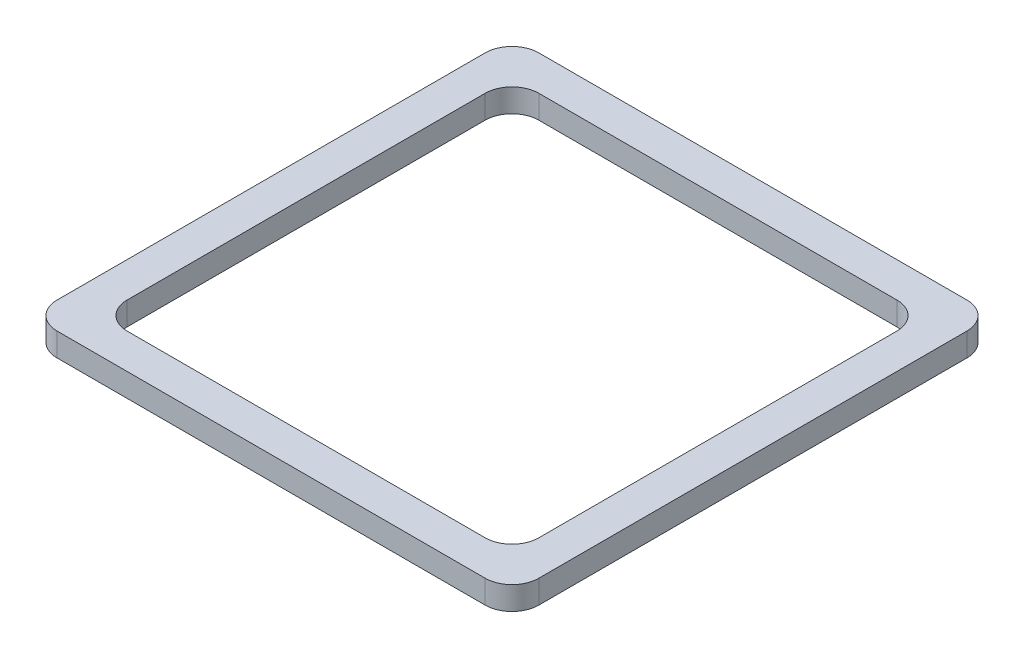
ISO-10303-21;
HEADER;
FILE_DESCRIPTION(('STEP AP214'),'2;1');
FILE_NAME('part.step','',(''),(''),'','','');
FILE_SCHEMA(('AUTOMOTIVE_DESIGN { 1 0 10303 214 1 1 1 1 }'));
ENDSEC;
DATA;
#1=APPLICATION_CONTEXT('core data for automotive mechanical design processes');
#2=APPLICATION_PROTOCOL_DEFINITION('international standard','automotive_design',2000,#1);
#3=PRODUCT_CONTEXT('',#1,'mechanical');
#4=PRODUCT('Part','Part','',(#3));
#5=PRODUCT_RELATED_PRODUCT_CATEGORY('part','',(#4));
#6=PRODUCT_DEFINITION_FORMATION('','',#4);
#7=PRODUCT_DEFINITION_CONTEXT('part definition',#1,'design');
#8=PRODUCT_DEFINITION('design','',#6,#7);
#9=PRODUCT_DEFINITION_SHAPE('','',#8);
#10=(LENGTH_UNIT() NAMED_UNIT(*) SI_UNIT(.MILLI.,.METRE.));
#11=(NAMED_UNIT(*) PLANE_ANGLE_UNIT() SI_UNIT($,.RADIAN.));
#12=(NAMED_UNIT(*) SI_UNIT($,.STERADIAN.) SOLID_ANGLE_UNIT());
#13=UNCERTAINTY_MEASURE_WITH_UNIT(LENGTH_MEASURE(1.E-05),#10,'distance_accuracy_value','');
#14=(GEOMETRIC_REPRESENTATION_CONTEXT(3) GLOBAL_UNCERTAINTY_ASSIGNED_CONTEXT((#13)) GLOBAL_UNIT_ASSIGNED_CONTEXT((#10,
#11,#12)) REPRESENTATION_CONTEXT('',''));
#15=CARTESIAN_POINT('',(0.,0.,0.));
#16=DIRECTION('',(0.,0.,1.));
#17=DIRECTION('',(1.,0.,0.));
#18=AXIS2_PLACEMENT_3D('',#15,#16,#17);
#19=CARTESIAN_POINT('',(0.,1.,10.325));
#20=DIRECTION('',(0.,0.,-1.));
#21=DIRECTION('',(-1.,0.,0.));
#22=AXIS2_PLACEMENT_3D('',#19,#20,#21);
#23=PLANE('',#22);
#24=DIRECTION('',(1.,0.,0.));
#25=VECTOR('',#24,1.);
#26=CARTESIAN_POINT('',(0.,1.,10.325));
#27=LINE('',#26,#25);
#28=CARTESIAN_POINT('',(-9.175,1.,10.325));
#29=VERTEX_POINT('',#28);
#30=CARTESIAN_POINT('',(9.175,1.,10.325));
#31=VERTEX_POINT('',#30);
#32=EDGE_CURVE('E192',#29,#31,#27,.T.);
#33=ORIENTED_EDGE('',*,*,#32,.F.);
#34=DIRECTION('',(0.,-1.,0.));
#35=VECTOR('',#34,1.);
#36=CARTESIAN_POINT('',(-9.175,0.,10.325));
#37=LINE('',#36,#35);
#38=CARTESIAN_POINT('',(-9.175,0.,10.325));
#39=VERTEX_POINT('',#38);
#40=EDGE_CURVE('E269',#29,#39,#37,.T.);
#41=ORIENTED_EDGE('',*,*,#40,.T.);
#42=DIRECTION('',(1.,0.,0.));
#43=VECTOR('',#42,1.);
#44=CARTESIAN_POINT('',(0.,0.,10.325));
#45=LINE('',#44,#43);
#46=CARTESIAN_POINT('',(9.175,0.,10.325));
#47=VERTEX_POINT('',#46);
#48=EDGE_CURVE('E220',#39,#47,#45,.T.);
#49=ORIENTED_EDGE('',*,*,#48,.T.);
#50=DIRECTION('',(0.,-1.,0.));
#51=VECTOR('',#50,1.);
#52=CARTESIAN_POINT('',(9.175,1.,10.325));
#53=LINE('',#52,#51);
#54=EDGE_CURVE('E267',#47,#31,#53,.F.);
#55=ORIENTED_EDGE('',*,*,#54,.T.);
#56=EDGE_LOOP('',(#33,#41,#49,#55));
#57=FACE_BOUND('',#56,.T.);
#58=ADVANCED_FACE('F37',(#57),#23,.F.);
#59=CARTESIAN_POINT('',(10.325,1.,0.));
#60=DIRECTION('',(-1.,0.,0.));
#61=DIRECTION('',(0.,0.,1.));
#62=AXIS2_PLACEMENT_3D('',#59,#60,#61);
#63=PLANE('',#62);
#64=DIRECTION('',(0.,0.,-1.));
#65=VECTOR('',#64,1.);
#66=CARTESIAN_POINT('',(10.325,1.,0.));
#67=LINE('',#66,#65);
#68=CARTESIAN_POINT('',(10.325,1.,9.175));
#69=VERTEX_POINT('',#68);
#70=CARTESIAN_POINT('',(10.325,1.,-9.175));
#71=VERTEX_POINT('',#70);
#72=EDGE_CURVE('E194',#69,#71,#67,.T.);
#73=ORIENTED_EDGE('',*,*,#72,.F.);
#74=DIRECTION('',(0.,-1.,0.));
#75=VECTOR('',#74,1.);
#76=CARTESIAN_POINT('',(10.325,1.,9.175));
#77=LINE('',#76,#75);
#78=CARTESIAN_POINT('',(10.325,0.,9.175));
#79=VERTEX_POINT('',#78);
#80=EDGE_CURVE('E11',#69,#79,#77,.T.);
#81=ORIENTED_EDGE('',*,*,#80,.T.);
#82=DIRECTION('',(0.,0.,-1.));
#83=VECTOR('',#82,1.);
#84=CARTESIAN_POINT('',(10.325,0.,0.));
#85=LINE('',#84,#83);
#86=CARTESIAN_POINT('',(10.325,0.,-9.175));
#87=VERTEX_POINT('',#86);
#88=EDGE_CURVE('E223',#79,#87,#85,.T.);
#89=ORIENTED_EDGE('',*,*,#88,.T.);
#90=DIRECTION('',(0.,-1.,0.));
#91=VECTOR('',#90,1.);
#92=CARTESIAN_POINT('',(10.325,1.,-9.175));
#93=LINE('',#92,#91);
#94=EDGE_CURVE('E45',#87,#71,#93,.F.);
#95=ORIENTED_EDGE('',*,*,#94,.T.);
#96=EDGE_LOOP('',(#73,#81,#89,#95));
#97=FACE_BOUND('',#96,.T.);
#98=ADVANCED_FACE('F285',(#97),#63,.F.);
#99=CARTESIAN_POINT('',(0.,1.,-10.325));
#100=DIRECTION('',(0.,0.,-1.));
#101=DIRECTION('',(-1.,0.,0.));
#102=AXIS2_PLACEMENT_3D('',#99,#100,#101);
#103=PLANE('',#102);
#104=DIRECTION('',(1.,0.,0.));
#105=VECTOR('',#104,1.);
#106=CARTESIAN_POINT('',(0.,0.,-10.325));
#107=LINE('',#106,#105);
#108=CARTESIAN_POINT('',(-9.175,0.,-10.325));
#109=VERTEX_POINT('',#108);
#110=CARTESIAN_POINT('',(9.175,0.,-10.325));
#111=VERTEX_POINT('',#110);
#112=EDGE_CURVE('E179',#109,#111,#107,.T.);
#113=ORIENTED_EDGE('',*,*,#112,.F.);
#114=DIRECTION('',(0.,-1.,0.));
#115=VECTOR('',#114,1.);
#116=CARTESIAN_POINT('',(-9.175,1.,-10.325));
#117=LINE('',#116,#115);
#118=CARTESIAN_POINT('',(-9.175,1.,-10.325));
#119=VERTEX_POINT('',#118);
#120=EDGE_CURVE('E258',#109,#119,#117,.F.);
#121=ORIENTED_EDGE('',*,*,#120,.T.);
#122=DIRECTION('',(1.,0.,0.));
#123=VECTOR('',#122,1.);
#124=CARTESIAN_POINT('',(0.,1.,-10.325));
#125=LINE('',#124,#123);
#126=CARTESIAN_POINT('',(9.175,1.,-10.325));
#127=VERTEX_POINT('',#126);
#128=EDGE_CURVE('E196',#119,#127,#125,.T.);
#129=ORIENTED_EDGE('',*,*,#128,.T.);
#130=DIRECTION('',(0.,-1.,0.));
#131=VECTOR('',#130,1.);
#132=CARTESIAN_POINT('',(9.175,0.,-10.325));
#133=LINE('',#132,#131);
#134=EDGE_CURVE('E255',#127,#111,#133,.T.);
#135=ORIENTED_EDGE('',*,*,#134,.T.);
#136=EDGE_LOOP('',(#113,#121,#129,#135));
#137=FACE_BOUND('',#136,.T.);
#138=ADVANCED_FACE('F292',(#137),#103,.T.);
#139=CARTESIAN_POINT('',(8.825,1.,0.));
#140=DIRECTION('',(-1.,0.,0.));
#141=DIRECTION('',(0.,0.,1.));
#142=AXIS2_PLACEMENT_3D('',#139,#140,#141);
#143=PLANE('',#142);
#144=DIRECTION('',(0.,0.,-1.));
#145=VECTOR('',#144,1.);
#146=CARTESIAN_POINT('',(8.825,0.,0.));
#147=LINE('',#146,#145);
#148=CARTESIAN_POINT('',(8.825,0.,7.675));
#149=VERTEX_POINT('',#148);
#150=CARTESIAN_POINT('',(8.825,0.,-7.675));
#151=VERTEX_POINT('',#150);
#152=EDGE_CURVE('E157',#149,#151,#147,.T.);
#153=ORIENTED_EDGE('',*,*,#152,.F.);
#154=DIRECTION('',(0.,-1.,0.));
#155=VECTOR('',#154,1.);
#156=CARTESIAN_POINT('',(8.825,1.,7.675));
#157=LINE('',#156,#155);
#158=CARTESIAN_POINT('',(8.825,1.,7.675));
#159=VERTEX_POINT('',#158);
#160=EDGE_CURVE('E151',#159,#149,#157,.T.);
#161=ORIENTED_EDGE('',*,*,#160,.F.);
#162=DIRECTION('',(0.,0.,-1.));
#163=VECTOR('',#162,1.);
#164=CARTESIAN_POINT('',(8.825,1.,0.));
#165=LINE('',#164,#163);
#166=CARTESIAN_POINT('',(8.825,1.,-7.675));
#167=VERTEX_POINT('',#166);
#168=EDGE_CURVE('E155',#159,#167,#165,.T.);
#169=ORIENTED_EDGE('',*,*,#168,.T.);
#170=DIRECTION('',(0.,-1.,0.));
#171=VECTOR('',#170,1.);
#172=CARTESIAN_POINT('',(8.825,1.,-7.675));
#173=LINE('',#172,#171);
#174=EDGE_CURVE('E202',#167,#151,#173,.T.);
#175=ORIENTED_EDGE('',*,*,#174,.T.);
#176=EDGE_LOOP('',(#153,#161,#169,#175));
#177=FACE_BOUND('',#176,.T.);
#178=ADVANCED_FACE('F153',(#177),#143,.T.);
#179=CARTESIAN_POINT('',(7.675,1.,7.675));
#180=DIRECTION('',(0.,-1.,0.));
#181=DIRECTION('',(0.,0.,-1.));
#182=AXIS2_PLACEMENT_3D('',#179,#180,#181);
#183=CYLINDRICAL_SURFACE('',#182,1.15);
#184=CARTESIAN_POINT('',(7.675,0.,7.675));
#185=DIRECTION('',(0.,1.,0.));
#186=DIRECTION('',(0.,0.,1.));
#187=AXIS2_PLACEMENT_3D('',#184,#185,#186);
#188=CIRCLE('',#187,1.15);
#189=CARTESIAN_POINT('',(7.675,0.,8.825));
#190=VERTEX_POINT('',#189);
#191=EDGE_CURVE('E204',#149,#190,#188,.F.);
#192=ORIENTED_EDGE('',*,*,#191,.T.);
#193=DIRECTION('',(0.,-1.,0.));
#194=VECTOR('',#193,1.);
#195=CARTESIAN_POINT('',(7.675,1.,8.825));
#196=LINE('',#195,#194);
#197=CARTESIAN_POINT('',(7.675,1.,8.825));
#198=VERTEX_POINT('',#197);
#199=EDGE_CURVE('E162',#198,#190,#196,.T.);
#200=ORIENTED_EDGE('',*,*,#199,.F.);
#201=CARTESIAN_POINT('',(7.675,1.,7.675));
#202=DIRECTION('',(0.,1.,0.));
#203=DIRECTION('',(0.,0.,1.));
#204=AXIS2_PLACEMENT_3D('',#201,#202,#203);
#205=CIRCLE('',#204,1.15);
#206=EDGE_CURVE('E165',#159,#198,#205,.F.);
#207=ORIENTED_EDGE('',*,*,#206,.F.);
#208=ORIENTED_EDGE('',*,*,#160,.T.);
#209=EDGE_LOOP('',(#192,#200,#207,#208));
#210=FACE_BOUND('',#209,.T.);
#211=ADVANCED_FACE('F166',(#210),#183,.F.);
#212=CARTESIAN_POINT('',(0.,1.,8.825));
#213=DIRECTION('',(0.,0.,-1.));
#214=DIRECTION('',(-1.,0.,0.));
#215=AXIS2_PLACEMENT_3D('',#212,#213,#214);
#216=PLANE('',#215);
#217=DIRECTION('',(1.,0.,0.));
#218=VECTOR('',#217,1.);
#219=CARTESIAN_POINT('',(0.,0.,8.825));
#220=LINE('',#219,#218);
#221=CARTESIAN_POINT('',(-7.675,0.,8.825));
#222=VERTEX_POINT('',#221);
#223=EDGE_CURVE('E206',#222,#190,#220,.T.);
#224=ORIENTED_EDGE('',*,*,#223,.F.);
#225=DIRECTION('',(0.,-1.,0.));
#226=VECTOR('',#225,1.);
#227=CARTESIAN_POINT('',(-7.675,1.,8.825));
#228=LINE('',#227,#226);
#229=CARTESIAN_POINT('',(-7.675,1.,8.825));
#230=VERTEX_POINT('',#229);
#231=EDGE_CURVE('E240',#230,#222,#228,.T.);
#232=ORIENTED_EDGE('',*,*,#231,.F.);
#233=DIRECTION('',(1.,0.,0.));
#234=VECTOR('',#233,1.);
#235=CARTESIAN_POINT('',(0.,1.,8.825));
#236=LINE('',#235,#234);
#237=EDGE_CURVE('E170',#230,#198,#236,.T.);
#238=ORIENTED_EDGE('',*,*,#237,.T.);
#239=ORIENTED_EDGE('',*,*,#199,.T.);
#240=EDGE_LOOP('',(#224,#232,#238,#239));
#241=FACE_BOUND('',#240,.T.);
#242=ADVANCED_FACE('F337',(#241),#216,.T.);
#243=CARTESIAN_POINT('',(-7.675,1.,7.675));
#244=DIRECTION('',(0.,-1.,0.));
#245=DIRECTION('',(0.,0.,-1.));
#246=AXIS2_PLACEMENT_3D('',#243,#244,#245);
#247=CYLINDRICAL_SURFACE('',#246,1.15);
#248=CARTESIAN_POINT('',(-7.675,0.,7.675));
#249=DIRECTION('',(0.,1.,0.));
#250=DIRECTION('',(0.,0.,1.));
#251=AXIS2_PLACEMENT_3D('',#248,#249,#250);
#252=CIRCLE('',#251,1.15);
#253=CARTESIAN_POINT('',(-8.825,0.,7.675));
#254=VERTEX_POINT('',#253);
#255=EDGE_CURVE('E209',#222,#254,#252,.F.);
#256=ORIENTED_EDGE('',*,*,#255,.T.);
#257=DIRECTION('',(0.,-1.,0.));
#258=VECTOR('',#257,1.);
#259=CARTESIAN_POINT('',(-8.825,1.,7.675));
#260=LINE('',#259,#258);
#261=CARTESIAN_POINT('',(-8.825,1.,7.675));
#262=VERTEX_POINT('',#261);
#263=EDGE_CURVE('E237',#262,#254,#260,.T.);
#264=ORIENTED_EDGE('',*,*,#263,.F.);
#265=CARTESIAN_POINT('',(-7.675,1.,7.675));
#266=DIRECTION('',(0.,1.,0.));
#267=DIRECTION('',(0.,0.,1.));
#268=AXIS2_PLACEMENT_3D('',#265,#266,#267);
#269=CIRCLE('',#268,1.15);
#270=EDGE_CURVE('E183',#230,#262,#269,.F.);
#271=ORIENTED_EDGE('',*,*,#270,.F.);
#272=ORIENTED_EDGE('',*,*,#231,.T.);
#273=EDGE_LOOP('',(#256,#264,#271,#272));
#274=FACE_BOUND('',#273,.T.);
#275=ADVANCED_FACE('F333',(#274),#247,.F.);
#276=CARTESIAN_POINT('',(-8.825,1.,0.));
#277=DIRECTION('',(-1.,0.,0.));
#278=DIRECTION('',(0.,0.,1.));
#279=AXIS2_PLACEMENT_3D('',#276,#277,#278);
#280=PLANE('',#279);
#281=DIRECTION('',(0.,0.,-1.));
#282=VECTOR('',#281,1.);
#283=CARTESIAN_POINT('',(-8.825,0.,0.));
#284=LINE('',#283,#282);
#285=CARTESIAN_POINT('',(-8.825,0.,-7.675));
#286=VERTEX_POINT('',#285);
#287=EDGE_CURVE('E211',#254,#286,#284,.T.);
#288=ORIENTED_EDGE('',*,*,#287,.T.);
#289=DIRECTION('',(0.,-1.,0.));
#290=VECTOR('',#289,1.);
#291=CARTESIAN_POINT('',(-8.825,1.,-7.675));
#292=LINE('',#291,#290);
#293=CARTESIAN_POINT('',(-8.825,1.,-7.675));
#294=VERTEX_POINT('',#293);
#295=EDGE_CURVE('E234',#294,#286,#292,.T.);
#296=ORIENTED_EDGE('',*,*,#295,.F.);
#297=DIRECTION('',(0.,0.,-1.));
#298=VECTOR('',#297,1.);
#299=CARTESIAN_POINT('',(-8.825,1.,0.));
#300=LINE('',#299,#298);
#301=EDGE_CURVE('E185',#262,#294,#300,.T.);
#302=ORIENTED_EDGE('',*,*,#301,.F.);
#303=ORIENTED_EDGE('',*,*,#263,.T.);
#304=EDGE_LOOP('',(#288,#296,#302,#303));
#305=FACE_BOUND('',#304,.T.);
#306=ADVANCED_FACE('F329',(#305),#280,.F.);
#307=CARTESIAN_POINT('',(-7.675,1.,-7.675));
#308=DIRECTION('',(0.,-1.,0.));
#309=DIRECTION('',(0.,0.,-1.));
#310=AXIS2_PLACEMENT_3D('',#307,#308,#309);
#311=CYLINDRICAL_SURFACE('',#310,1.15);
#312=CARTESIAN_POINT('',(-7.675,0.,-7.675));
#313=DIRECTION('',(0.,1.,0.));
#314=DIRECTION('',(0.,0.,1.));
#315=AXIS2_PLACEMENT_3D('',#312,#313,#314);
#316=CIRCLE('',#315,1.15);
#317=CARTESIAN_POINT('',(-7.675,0.,-8.825));
#318=VERTEX_POINT('',#317);
#319=EDGE_CURVE('E213',#286,#318,#316,.F.);
#320=ORIENTED_EDGE('',*,*,#319,.T.);
#321=DIRECTION('',(0.,-1.,0.));
#322=VECTOR('',#321,1.);
#323=CARTESIAN_POINT('',(-7.675,1.,-8.825));
#324=LINE('',#323,#322);
#325=CARTESIAN_POINT('',(-7.675,1.,-8.825));
#326=VERTEX_POINT('',#325);
#327=EDGE_CURVE('E231',#326,#318,#324,.T.);
#328=ORIENTED_EDGE('',*,*,#327,.F.);
#329=CARTESIAN_POINT('',(-7.675,1.,-7.675));
#330=DIRECTION('',(0.,1.,0.));
#331=DIRECTION('',(0.,0.,1.));
#332=AXIS2_PLACEMENT_3D('',#329,#330,#331);
#333=CIRCLE('',#332,1.15);
#334=EDGE_CURVE('E187',#294,#326,#333,.F.);
#335=ORIENTED_EDGE('',*,*,#334,.F.);
#336=ORIENTED_EDGE('',*,*,#295,.T.);
#337=EDGE_LOOP('',(#320,#328,#335,#336));
#338=FACE_BOUND('',#337,.T.);
#339=ADVANCED_FACE('F325',(#338),#311,.F.);
#340=CARTESIAN_POINT('',(0.,1.,-8.825));
#341=DIRECTION('',(0.,0.,-1.));
#342=DIRECTION('',(-1.,0.,0.));
#343=AXIS2_PLACEMENT_3D('',#340,#341,#342);
#344=PLANE('',#343);
#345=DIRECTION('',(1.,0.,0.));
#346=VECTOR('',#345,1.);
#347=CARTESIAN_POINT('',(0.,0.,-8.825));
#348=LINE('',#347,#346);
#349=CARTESIAN_POINT('',(7.675,0.,-8.825));
#350=VERTEX_POINT('',#349);
#351=EDGE_CURVE('E215',#318,#350,#348,.T.);
#352=ORIENTED_EDGE('',*,*,#351,.T.);
#353=DIRECTION('',(0.,-1.,0.));
#354=VECTOR('',#353,1.);
#355=CARTESIAN_POINT('',(7.675,1.,-8.825));
#356=LINE('',#355,#354);
#357=CARTESIAN_POINT('',(7.675,1.,-8.825));
#358=VERTEX_POINT('',#357);
#359=EDGE_CURVE('E228',#358,#350,#356,.T.);
#360=ORIENTED_EDGE('',*,*,#359,.F.);
#361=DIRECTION('',(1.,0.,0.));
#362=VECTOR('',#361,1.);
#363=CARTESIAN_POINT('',(0.,1.,-8.825));
#364=LINE('',#363,#362);
#365=EDGE_CURVE('E189',#326,#358,#364,.T.);
#366=ORIENTED_EDGE('',*,*,#365,.F.);
#367=ORIENTED_EDGE('',*,*,#327,.T.);
#368=EDGE_LOOP('',(#352,#360,#366,#367));
#369=FACE_BOUND('',#368,.T.);
#370=ADVANCED_FACE('F321',(#369),#344,.F.);
#371=CARTESIAN_POINT('',(7.675,1.,-7.675));
#372=DIRECTION('',(0.,-1.,0.));
#373=DIRECTION('',(0.,0.,-1.));
#374=AXIS2_PLACEMENT_3D('',#371,#372,#373);
#375=CYLINDRICAL_SURFACE('',#374,1.15);
#376=CARTESIAN_POINT('',(7.675,0.,-7.675));
#377=DIRECTION('',(0.,1.,0.));
#378=DIRECTION('',(0.,0.,1.));
#379=AXIS2_PLACEMENT_3D('',#376,#377,#378);
#380=CIRCLE('',#379,1.15);
#381=EDGE_CURVE('E217',#350,#151,#380,.F.);
#382=ORIENTED_EDGE('',*,*,#381,.T.);
#383=ORIENTED_EDGE('',*,*,#174,.F.);
#384=CARTESIAN_POINT('',(7.675,1.,-7.675));
#385=DIRECTION('',(0.,1.,0.));
#386=DIRECTION('',(0.,0.,1.));
#387=AXIS2_PLACEMENT_3D('',#384,#385,#386);
#388=CIRCLE('',#387,1.15);
#389=EDGE_CURVE('E174',#358,#167,#388,.F.);
#390=ORIENTED_EDGE('',*,*,#389,.F.);
#391=ORIENTED_EDGE('',*,*,#359,.T.);
#392=EDGE_LOOP('',(#382,#383,#390,#391));
#393=FACE_BOUND('',#392,.T.);
#394=ADVANCED_FACE('F318',(#393),#375,.F.);
#395=CARTESIAN_POINT('',(-10.325,1.,0.));
#396=DIRECTION('',(-1.,0.,0.));
#397=DIRECTION('',(0.,0.,1.));
#398=AXIS2_PLACEMENT_3D('',#395,#396,#397);
#399=PLANE('',#398);
#400=DIRECTION('',(0.,0.,-1.));
#401=VECTOR('',#400,1.);
#402=CARTESIAN_POINT('',(-10.325,1.,0.));
#403=LINE('',#402,#401);
#404=CARTESIAN_POINT('',(-10.325,1.,9.175));
#405=VERTEX_POINT('',#404);
#406=CARTESIAN_POINT('',(-10.325,1.,-9.175));
#407=VERTEX_POINT('',#406);
#408=EDGE_CURVE('E199',#405,#407,#403,.T.);
#409=ORIENTED_EDGE('',*,*,#408,.T.);
#410=DIRECTION('',(0.,-1.,0.));
#411=VECTOR('',#410,1.);
#412=CARTESIAN_POINT('',(-10.325,1.,-9.175));
#413=LINE('',#412,#411);
#414=CARTESIAN_POINT('',(-10.325,0.,-9.175));
#415=VERTEX_POINT('',#414);
#416=EDGE_CURVE('E244',#407,#415,#413,.T.);
#417=ORIENTED_EDGE('',*,*,#416,.T.);
#418=DIRECTION('',(0.,0.,-1.));
#419=VECTOR('',#418,1.);
#420=CARTESIAN_POINT('',(-10.325,0.,0.));
#421=LINE('',#420,#419);
#422=CARTESIAN_POINT('',(-10.325,0.,9.175));
#423=VERTEX_POINT('',#422);
#424=EDGE_CURVE('E176',#423,#415,#421,.T.);
#425=ORIENTED_EDGE('',*,*,#424,.F.);
#426=DIRECTION('',(0.,-1.,0.));
#427=VECTOR('',#426,1.);
#428=CARTESIAN_POINT('',(-10.325,1.,9.175));
#429=LINE('',#428,#427);
#430=EDGE_CURVE('E161',#423,#405,#429,.F.);
#431=ORIENTED_EDGE('',*,*,#430,.T.);
#432=EDGE_LOOP('',(#409,#417,#425,#431));
#433=FACE_BOUND('',#432,.T.);
#434=ADVANCED_FACE('F299',(#433),#399,.T.);
#435=CARTESIAN_POINT('',(0.,1.,0.));
#436=DIRECTION('',(0.,1.,0.));
#437=DIRECTION('',(0.,0.,1.));
#438=AXIS2_PLACEMENT_3D('',#435,#436,#437);
#439=PLANE('',#438);
#440=ORIENTED_EDGE('',*,*,#168,.F.);
#441=ORIENTED_EDGE('',*,*,#206,.T.);
#442=ORIENTED_EDGE('',*,*,#237,.F.);
#443=ORIENTED_EDGE('',*,*,#270,.T.);
#444=ORIENTED_EDGE('',*,*,#301,.T.);
#445=ORIENTED_EDGE('',*,*,#334,.T.);
#446=ORIENTED_EDGE('',*,*,#365,.T.);
#447=ORIENTED_EDGE('',*,*,#389,.T.);
#448=EDGE_LOOP('',(#440,#441,#442,#443,#444,#445,#446,#447));
#449=FACE_BOUND('',#448,.T.);
#450=ORIENTED_EDGE('',*,*,#128,.F.);
#451=CARTESIAN_POINT('',(-9.175,1.,-9.175));
#452=DIRECTION('',(0.,1.,0.));
#453=DIRECTION('',(0.,0.,1.));
#454=AXIS2_PLACEMENT_3D('',#451,#452,#453);
#455=CIRCLE('',#454,1.15);
#456=EDGE_CURVE('E265',#119,#407,#455,.T.);
#457=ORIENTED_EDGE('',*,*,#456,.T.);
#458=ORIENTED_EDGE('',*,*,#408,.F.);
#459=CARTESIAN_POINT('',(-9.175,1.,9.175));
#460=DIRECTION('',(0.,1.,0.));
#461=DIRECTION('',(0.,0.,1.));
#462=AXIS2_PLACEMENT_3D('',#459,#460,#461);
#463=CIRCLE('',#462,1.15);
#464=EDGE_CURVE('E263',#405,#29,#463,.T.);
#465=ORIENTED_EDGE('',*,*,#464,.T.);
#466=ORIENTED_EDGE('',*,*,#32,.T.);
#467=CARTESIAN_POINT('',(9.175,1.,9.175));
#468=DIRECTION('',(0.,1.,0.));
#469=DIRECTION('',(0.,0.,1.));
#470=AXIS2_PLACEMENT_3D('',#467,#468,#469);
#471=CIRCLE('',#470,1.15);
#472=EDGE_CURVE('E58',#31,#69,#471,.T.);
#473=ORIENTED_EDGE('',*,*,#472,.T.);
#474=ORIENTED_EDGE('',*,*,#72,.T.);
#475=CARTESIAN_POINT('',(9.175,1.,-9.175));
#476=DIRECTION('',(0.,1.,0.));
#477=DIRECTION('',(0.,0.,1.));
#478=AXIS2_PLACEMENT_3D('',#475,#476,#477);
#479=CIRCLE('',#478,1.15);
#480=EDGE_CURVE('E260',#71,#127,#479,.T.);
#481=ORIENTED_EDGE('',*,*,#480,.T.);
#482=EDGE_LOOP('',(#450,#457,#458,#465,#466,#473,#474,#481));
#483=FACE_BOUND('',#482,.T.);
#484=ADVANCED_FACE('F172',(#449,#483),#439,.T.);
#485=CARTESIAN_POINT('',(0.,0.,0.));
#486=DIRECTION('',(0.,1.,0.));
#487=DIRECTION('',(0.,0.,1.));
#488=AXIS2_PLACEMENT_3D('',#485,#486,#487);
#489=PLANE('',#488);
#490=ORIENTED_EDGE('',*,*,#152,.T.);
#491=ORIENTED_EDGE('',*,*,#381,.F.);
#492=ORIENTED_EDGE('',*,*,#351,.F.);
#493=ORIENTED_EDGE('',*,*,#319,.F.);
#494=ORIENTED_EDGE('',*,*,#287,.F.);
#495=ORIENTED_EDGE('',*,*,#255,.F.);
#496=ORIENTED_EDGE('',*,*,#223,.T.);
#497=ORIENTED_EDGE('',*,*,#191,.F.);
#498=EDGE_LOOP('',(#490,#491,#492,#493,#494,#495,#496,#497));
#499=FACE_BOUND('',#498,.T.);
#500=ORIENTED_EDGE('',*,*,#424,.T.);
#501=CARTESIAN_POINT('',(-9.175,0.,-9.175));
#502=DIRECTION('',(0.,1.,0.));
#503=DIRECTION('',(0.,0.,1.));
#504=AXIS2_PLACEMENT_3D('',#501,#502,#503);
#505=CIRCLE('',#504,1.15);
#506=EDGE_CURVE('E253',#415,#109,#505,.F.);
#507=ORIENTED_EDGE('',*,*,#506,.T.);
#508=ORIENTED_EDGE('',*,*,#112,.T.);
#509=CARTESIAN_POINT('',(9.175,0.,-9.175));
#510=DIRECTION('',(0.,1.,0.));
#511=DIRECTION('',(0.,0.,1.));
#512=AXIS2_PLACEMENT_3D('',#509,#510,#511);
#513=CIRCLE('',#512,1.15);
#514=EDGE_CURVE('E247',#111,#87,#513,.F.);
#515=ORIENTED_EDGE('',*,*,#514,.T.);
#516=ORIENTED_EDGE('',*,*,#88,.F.);
#517=CARTESIAN_POINT('',(9.175,0.,9.175));
#518=DIRECTION('',(0.,1.,0.));
#519=DIRECTION('',(0.,0.,1.));
#520=AXIS2_PLACEMENT_3D('',#517,#518,#519);
#521=CIRCLE('',#520,1.15);
#522=EDGE_CURVE('E249',#79,#47,#521,.F.);
#523=ORIENTED_EDGE('',*,*,#522,.T.);
#524=ORIENTED_EDGE('',*,*,#48,.F.);
#525=CARTESIAN_POINT('',(-9.175,0.,9.175));
#526=DIRECTION('',(0.,1.,0.));
#527=DIRECTION('',(0.,0.,1.));
#528=AXIS2_PLACEMENT_3D('',#525,#526,#527);
#529=CIRCLE('',#528,1.15);
#530=EDGE_CURVE('E251',#39,#423,#529,.F.);
#531=ORIENTED_EDGE('',*,*,#530,.T.);
#532=EDGE_LOOP('',(#500,#507,#508,#515,#516,#523,#524,#531));
#533=FACE_BOUND('',#532,.T.);
#534=ADVANCED_FACE('F279',(#499,#533),#489,.F.);
#535=CARTESIAN_POINT('',(-9.175,1.,-9.175));
#536=DIRECTION('',(0.,-1.,0.));
#537=DIRECTION('',(0.,0.,-1.));
#538=AXIS2_PLACEMENT_3D('',#535,#536,#537);
#539=CYLINDRICAL_SURFACE('',#538,1.15);
#540=ORIENTED_EDGE('',*,*,#456,.F.);
#541=ORIENTED_EDGE('',*,*,#120,.F.);
#542=ORIENTED_EDGE('',*,*,#506,.F.);
#543=ORIENTED_EDGE('',*,*,#416,.F.);
#544=EDGE_LOOP('',(#540,#541,#542,#543));
#545=FACE_BOUND('',#544,.T.);
#546=ADVANCED_FACE('F297',(#545),#539,.T.);
#547=CARTESIAN_POINT('',(-9.175,1.,9.175));
#548=DIRECTION('',(0.,1.,0.));
#549=DIRECTION('',(0.,0.,1.));
#550=AXIS2_PLACEMENT_3D('',#547,#548,#549);
#551=CYLINDRICAL_SURFACE('',#550,1.15);
#552=ORIENTED_EDGE('',*,*,#464,.F.);
#553=ORIENTED_EDGE('',*,*,#430,.F.);
#554=ORIENTED_EDGE('',*,*,#530,.F.);
#555=ORIENTED_EDGE('',*,*,#40,.F.);
#556=EDGE_LOOP('',(#552,#553,#554,#555));
#557=FACE_BOUND('',#556,.T.);
#558=ADVANCED_FACE('F302',(#557),#551,.T.);
#559=CARTESIAN_POINT('',(9.175,1.,9.175));
#560=DIRECTION('',(0.,-1.,0.));
#561=DIRECTION('',(0.,0.,-1.));
#562=AXIS2_PLACEMENT_3D('',#559,#560,#561);
#563=CYLINDRICAL_SURFACE('',#562,1.15);
#564=ORIENTED_EDGE('',*,*,#472,.F.);
#565=ORIENTED_EDGE('',*,*,#54,.F.);
#566=ORIENTED_EDGE('',*,*,#522,.F.);
#567=ORIENTED_EDGE('',*,*,#80,.F.);
#568=EDGE_LOOP('',(#564,#565,#566,#567));
#569=FACE_BOUND('',#568,.T.);
#570=ADVANCED_FACE('F284',(#569),#563,.T.);
#571=CARTESIAN_POINT('',(9.175,1.,-9.175));
#572=DIRECTION('',(0.,1.,0.));
#573=DIRECTION('',(0.,0.,1.));
#574=AXIS2_PLACEMENT_3D('',#571,#572,#573);
#575=CYLINDRICAL_SURFACE('',#574,1.15);
#576=ORIENTED_EDGE('',*,*,#480,.F.);
#577=ORIENTED_EDGE('',*,*,#94,.F.);
#578=ORIENTED_EDGE('',*,*,#514,.F.);
#579=ORIENTED_EDGE('',*,*,#134,.F.);
#580=EDGE_LOOP('',(#576,#577,#578,#579));
#581=FACE_BOUND('',#580,.T.);
#582=ADVANCED_FACE('F39',(#581),#575,.T.);
#583=CLOSED_SHELL('',(#58,#98,#138,#178,#211,#242,#275,#306,#339,#370,#394,#434,#484,#534,#546,
#558,#570,#582));
#584=MANIFOLD_SOLID_BREP('B2',#583);
#585=ADVANCED_BREP_SHAPE_REPRESENTATION('',(#18,#584),#14);
#586=SHAPE_DEFINITION_REPRESENTATION(#9,#585);
ENDSEC;
END-ISO-10303-21;
